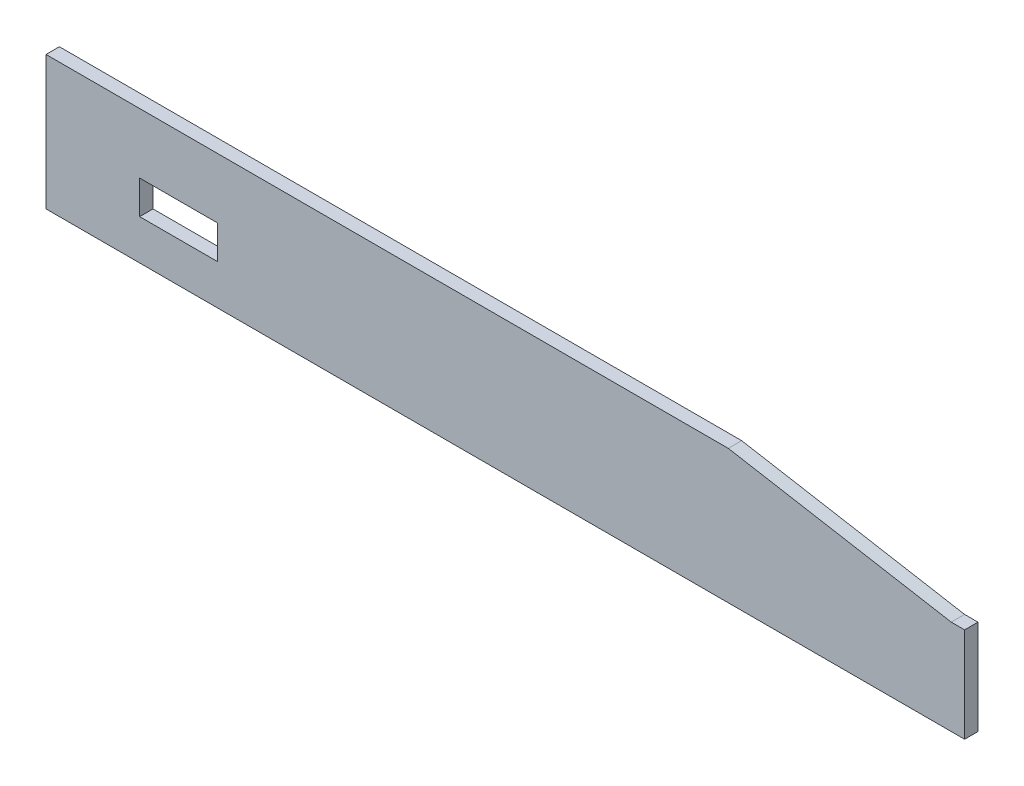
ISO-10303-21;
HEADER;
FILE_DESCRIPTION(('STEP AP214'),'2;1');
FILE_NAME('part.step','',(''),(''),'','','');
FILE_SCHEMA(('AUTOMOTIVE_DESIGN { 1 0 10303 214 1 1 1 1 }'));
ENDSEC;
DATA;
#1=APPLICATION_CONTEXT('core data for automotive mechanical design processes');
#2=APPLICATION_PROTOCOL_DEFINITION('international standard','automotive_design',2000,#1);
#3=PRODUCT_CONTEXT('',#1,'mechanical');
#4=PRODUCT('Part','Part','',(#3));
#5=PRODUCT_RELATED_PRODUCT_CATEGORY('part','',(#4));
#6=PRODUCT_DEFINITION_FORMATION('','',#4);
#7=PRODUCT_DEFINITION_CONTEXT('part definition',#1,'design');
#8=PRODUCT_DEFINITION('design','',#6,#7);
#9=PRODUCT_DEFINITION_SHAPE('','',#8);
#10=(LENGTH_UNIT() NAMED_UNIT(*) SI_UNIT(.MILLI.,.METRE.));
#11=(NAMED_UNIT(*) PLANE_ANGLE_UNIT() SI_UNIT($,.RADIAN.));
#12=(NAMED_UNIT(*) SI_UNIT($,.STERADIAN.) SOLID_ANGLE_UNIT());
#13=UNCERTAINTY_MEASURE_WITH_UNIT(LENGTH_MEASURE(1.E-05),#10,'distance_accuracy_value','');
#14=(GEOMETRIC_REPRESENTATION_CONTEXT(3) GLOBAL_UNCERTAINTY_ASSIGNED_CONTEXT((#13)) GLOBAL_UNIT_ASSIGNED_CONTEXT((#10,
#11,#12)) REPRESENTATION_CONTEXT('',''));
#15=CARTESIAN_POINT('',(0.,0.,0.));
#16=DIRECTION('',(0.,0.,1.));
#17=DIRECTION('',(1.,0.,0.));
#18=AXIS2_PLACEMENT_3D('',#15,#16,#17);
#19=CARTESIAN_POINT('',(0.,0.,6.));
#20=DIRECTION('',(0.,0.,1.));
#21=DIRECTION('',(1.,0.,0.));
#22=AXIS2_PLACEMENT_3D('',#19,#20,#21);
#23=PLANE('',#22);
#24=DIRECTION('',(-1.,0.,0.));
#25=VECTOR('',#24,1.);
#26=CARTESIAN_POINT('',(153.,30.,6.));
#27=LINE('',#26,#25);
#28=CARTESIAN_POINT('',(153.,30.,6.));
#29=VERTEX_POINT('',#28);
#30=CARTESIAN_POINT('',(-153.,30.,6.));
#31=VERTEX_POINT('',#30);
#32=EDGE_CURVE('E145',#29,#31,#27,.T.);
#33=ORIENTED_EDGE('',*,*,#32,.T.);
#34=DIRECTION('',(0.,-1.,0.));
#35=VECTOR('',#34,1.);
#36=CARTESIAN_POINT('',(-153.,30.,6.));
#37=LINE('',#36,#35);
#38=CARTESIAN_POINT('',(-153.,-30.,6.));
#39=VERTEX_POINT('',#38);
#40=EDGE_CURVE('E148',#31,#39,#37,.T.);
#41=ORIENTED_EDGE('',*,*,#40,.T.);
#42=DIRECTION('',(1.,0.,0.));
#43=VECTOR('',#42,1.);
#44=CARTESIAN_POINT('',(-153.,-30.,6.));
#45=LINE('',#44,#43);
#46=CARTESIAN_POINT('',(259.,-30.0000000000001,6.));
#47=VERTEX_POINT('',#46);
#48=EDGE_CURVE('E151',#39,#47,#45,.T.);
#49=ORIENTED_EDGE('',*,*,#48,.T.);
#50=DIRECTION('',(0.,1.,0.));
#51=VECTOR('',#50,1.);
#52=CARTESIAN_POINT('',(259.,-30.0000000000001,6.));
#53=LINE('',#52,#51);
#54=CARTESIAN_POINT('',(259.,12.4999999999999,6.));
#55=VERTEX_POINT('',#54);
#56=EDGE_CURVE('E153',#47,#55,#53,.T.);
#57=ORIENTED_EDGE('',*,*,#56,.T.);
#58=DIRECTION('',(-1.,0.,0.));
#59=VECTOR('',#58,1.);
#60=CARTESIAN_POINT('',(259.,12.4999999999999,6.));
#61=LINE('',#60,#59);
#62=CARTESIAN_POINT('',(253.,12.5000000000001,6.));
#63=VERTEX_POINT('',#62);
#64=EDGE_CURVE('E155',#55,#63,#61,.T.);
#65=ORIENTED_EDGE('',*,*,#64,.T.);
#66=DIRECTION('',(-0.985030467155704,0.172380331752248,0.));
#67=VECTOR('',#66,1.);
#68=CARTESIAN_POINT('',(253.,12.5000000000001,6.));
#69=LINE('',#68,#67);
#70=EDGE_CURVE('E157',#63,#29,#69,.T.);
#71=ORIENTED_EDGE('',*,*,#70,.T.);
#72=EDGE_LOOP('',(#33,#41,#49,#57,#65,#71));
#73=FACE_BOUND('',#72,.T.);
#74=DIRECTION('',(-1.,0.,0.));
#75=VECTOR('',#74,1.);
#76=CARTESIAN_POINT('',(-76.0000000000001,2.99999999999999,6.));
#77=LINE('',#76,#75);
#78=CARTESIAN_POINT('',(-76.0000000000001,2.99999999999999,6.));
#79=VERTEX_POINT('',#78);
#80=CARTESIAN_POINT('',(-111.,2.99999999999998,6.));
#81=VERTEX_POINT('',#80);
#82=EDGE_CURVE('E117',#79,#81,#77,.T.);
#83=ORIENTED_EDGE('',*,*,#82,.F.);
#84=DIRECTION('',(0.,1.,0.));
#85=VECTOR('',#84,1.);
#86=CARTESIAN_POINT('',(-76.0000000000001,2.99999999999999,6.));
#87=LINE('',#86,#85);
#88=CARTESIAN_POINT('',(-76.,-12.,6.));
#89=VERTEX_POINT('',#88);
#90=EDGE_CURVE('E109',#89,#79,#87,.T.);
#91=ORIENTED_EDGE('',*,*,#90,.F.);
#92=DIRECTION('',(1.,0.,0.));
#93=VECTOR('',#92,1.);
#94=CARTESIAN_POINT('',(-76.,-12.,6.));
#95=LINE('',#94,#93);
#96=CARTESIAN_POINT('',(-111.,-12.,6.));
#97=VERTEX_POINT('',#96);
#98=EDGE_CURVE('E131',#97,#89,#95,.T.);
#99=ORIENTED_EDGE('',*,*,#98,.F.);
#100=DIRECTION('',(0.,-1.,0.));
#101=VECTOR('',#100,1.);
#102=CARTESIAN_POINT('',(-111.,2.99999999999998,6.));
#103=LINE('',#102,#101);
#104=EDGE_CURVE('E129',#81,#97,#103,.T.);
#105=ORIENTED_EDGE('',*,*,#104,.F.);
#106=EDGE_LOOP('',(#83,#91,#99,#105));
#107=FACE_BOUND('',#106,.T.);
#108=ADVANCED_FACE('F32',(#73,#107),#23,.T.);
#109=CARTESIAN_POINT('',(0.,0.,0.));
#110=DIRECTION('',(0.,0.,1.));
#111=DIRECTION('',(1.,0.,0.));
#112=AXIS2_PLACEMENT_3D('',#109,#110,#111);
#113=PLANE('',#112);
#114=DIRECTION('',(-1.,0.,0.));
#115=VECTOR('',#114,1.);
#116=CARTESIAN_POINT('',(153.,30.,0.));
#117=LINE('',#116,#115);
#118=CARTESIAN_POINT('',(153.,30.,0.));
#119=VERTEX_POINT('',#118);
#120=CARTESIAN_POINT('',(-153.,30.,0.));
#121=VERTEX_POINT('',#120);
#122=EDGE_CURVE('E125',#119,#121,#117,.T.);
#123=ORIENTED_EDGE('',*,*,#122,.F.);
#124=DIRECTION('',(-0.985030467155704,0.172380331752248,0.));
#125=VECTOR('',#124,1.);
#126=CARTESIAN_POINT('',(253.,12.5000000000001,0.));
#127=LINE('',#126,#125);
#128=CARTESIAN_POINT('',(253.,12.5000000000001,0.));
#129=VERTEX_POINT('',#128);
#130=EDGE_CURVE('E149',#129,#119,#127,.T.);
#131=ORIENTED_EDGE('',*,*,#130,.F.);
#132=DIRECTION('',(-1.,0.,0.));
#133=VECTOR('',#132,1.);
#134=CARTESIAN_POINT('',(259.,12.4999999999999,0.));
#135=LINE('',#134,#133);
#136=CARTESIAN_POINT('',(259.,12.4999999999999,0.));
#137=VERTEX_POINT('',#136);
#138=EDGE_CURVE('E168',#137,#129,#135,.T.);
#139=ORIENTED_EDGE('',*,*,#138,.F.);
#140=DIRECTION('',(0.,1.,0.));
#141=VECTOR('',#140,1.);
#142=CARTESIAN_POINT('',(259.,-30.0000000000001,0.));
#143=LINE('',#142,#141);
#144=CARTESIAN_POINT('',(259.,-30.0000000000001,0.));
#145=VERTEX_POINT('',#144);
#146=EDGE_CURVE('E166',#145,#137,#143,.T.);
#147=ORIENTED_EDGE('',*,*,#146,.F.);
#148=DIRECTION('',(1.,0.,0.));
#149=VECTOR('',#148,1.);
#150=CARTESIAN_POINT('',(-153.,-30.,0.));
#151=LINE('',#150,#149);
#152=CARTESIAN_POINT('',(-153.,-30.,0.));
#153=VERTEX_POINT('',#152);
#154=EDGE_CURVE('E164',#153,#145,#151,.T.);
#155=ORIENTED_EDGE('',*,*,#154,.F.);
#156=DIRECTION('',(0.,-1.,0.));
#157=VECTOR('',#156,1.);
#158=CARTESIAN_POINT('',(-153.,30.,0.));
#159=LINE('',#158,#157);
#160=EDGE_CURVE('E162',#121,#153,#159,.T.);
#161=ORIENTED_EDGE('',*,*,#160,.F.);
#162=EDGE_LOOP('',(#123,#131,#139,#147,#155,#161));
#163=FACE_BOUND('',#162,.T.);
#164=DIRECTION('',(0.,1.,0.));
#165=VECTOR('',#164,1.);
#166=CARTESIAN_POINT('',(-76.0000000000001,2.99999999999999,0.));
#167=LINE('',#166,#165);
#168=CARTESIAN_POINT('',(-76.,-12.,0.));
#169=VERTEX_POINT('',#168);
#170=CARTESIAN_POINT('',(-76.0000000000001,2.99999999999999,0.));
#171=VERTEX_POINT('',#170);
#172=EDGE_CURVE('E55',#169,#171,#167,.T.);
#173=ORIENTED_EDGE('',*,*,#172,.T.);
#174=DIRECTION('',(-1.,0.,0.));
#175=VECTOR('',#174,1.);
#176=CARTESIAN_POINT('',(-76.0000000000001,2.99999999999999,0.));
#177=LINE('',#176,#175);
#178=CARTESIAN_POINT('',(-111.,2.99999999999998,0.));
#179=VERTEX_POINT('',#178);
#180=EDGE_CURVE('E124',#171,#179,#177,.T.);
#181=ORIENTED_EDGE('',*,*,#180,.T.);
#182=DIRECTION('',(0.,-1.,0.));
#183=VECTOR('',#182,1.);
#184=CARTESIAN_POINT('',(-111.,2.99999999999998,0.));
#185=LINE('',#184,#183);
#186=CARTESIAN_POINT('',(-111.,-12.,0.));
#187=VERTEX_POINT('',#186);
#188=EDGE_CURVE('E137',#179,#187,#185,.T.);
#189=ORIENTED_EDGE('',*,*,#188,.T.);
#190=DIRECTION('',(1.,0.,0.));
#191=VECTOR('',#190,1.);
#192=CARTESIAN_POINT('',(-76.,-12.,0.));
#193=LINE('',#192,#191);
#194=EDGE_CURVE('E118',#187,#169,#193,.T.);
#195=ORIENTED_EDGE('',*,*,#194,.T.);
#196=EDGE_LOOP('',(#173,#181,#189,#195));
#197=FACE_BOUND('',#196,.T.);
#198=ADVANCED_FACE('F192',(#163,#197),#113,.F.);
#199=CARTESIAN_POINT('',(153.,30.,6.));
#200=DIRECTION('',(0.,-1.,0.));
#201=DIRECTION('',(0.,0.,-1.));
#202=AXIS2_PLACEMENT_3D('',#199,#200,#201);
#203=PLANE('',#202);
#204=ORIENTED_EDGE('',*,*,#122,.T.);
#205=DIRECTION('',(0.,0.,-1.));
#206=VECTOR('',#205,1.);
#207=CARTESIAN_POINT('',(-153.,30.,6.));
#208=LINE('',#207,#206);
#209=EDGE_CURVE('E11',#31,#121,#208,.T.);
#210=ORIENTED_EDGE('',*,*,#209,.F.);
#211=ORIENTED_EDGE('',*,*,#32,.F.);
#212=DIRECTION('',(0.,0.,-1.));
#213=VECTOR('',#212,1.);
#214=CARTESIAN_POINT('',(153.,30.,6.));
#215=LINE('',#214,#213);
#216=EDGE_CURVE('E159',#29,#119,#215,.T.);
#217=ORIENTED_EDGE('',*,*,#216,.T.);
#218=EDGE_LOOP('',(#204,#210,#211,#217));
#219=FACE_BOUND('',#218,.T.);
#220=ADVANCED_FACE('F34',(#219),#203,.F.);
#221=CARTESIAN_POINT('',(-153.,30.,6.));
#222=DIRECTION('',(1.,0.,0.));
#223=DIRECTION('',(0.,0.,-1.));
#224=AXIS2_PLACEMENT_3D('',#221,#222,#223);
#225=PLANE('',#224);
#226=ORIENTED_EDGE('',*,*,#160,.T.);
#227=DIRECTION('',(0.,0.,-1.));
#228=VECTOR('',#227,1.);
#229=CARTESIAN_POINT('',(-153.,-30.,6.));
#230=LINE('',#229,#228);
#231=EDGE_CURVE('E40',#39,#153,#230,.T.);
#232=ORIENTED_EDGE('',*,*,#231,.F.);
#233=ORIENTED_EDGE('',*,*,#40,.F.);
#234=ORIENTED_EDGE('',*,*,#209,.T.);
#235=EDGE_LOOP('',(#226,#232,#233,#234));
#236=FACE_BOUND('',#235,.T.);
#237=ADVANCED_FACE('F209',(#236),#225,.F.);
#238=CARTESIAN_POINT('',(-153.,-30.,6.));
#239=DIRECTION('',(0.,1.,0.));
#240=DIRECTION('',(-1.,0.,0.));
#241=AXIS2_PLACEMENT_3D('',#238,#239,#240);
#242=PLANE('',#241);
#243=ORIENTED_EDGE('',*,*,#154,.T.);
#244=DIRECTION('',(0.,0.,-1.));
#245=VECTOR('',#244,1.);
#246=CARTESIAN_POINT('',(259.,-30.0000000000001,6.));
#247=LINE('',#246,#245);
#248=EDGE_CURVE('E179',#47,#145,#247,.T.);
#249=ORIENTED_EDGE('',*,*,#248,.F.);
#250=ORIENTED_EDGE('',*,*,#48,.F.);
#251=ORIENTED_EDGE('',*,*,#231,.T.);
#252=EDGE_LOOP('',(#243,#249,#250,#251));
#253=FACE_BOUND('',#252,.T.);
#254=ADVANCED_FACE('F186',(#253),#242,.F.);
#255=CARTESIAN_POINT('',(259.,-30.0000000000001,6.));
#256=DIRECTION('',(-1.,0.,0.));
#257=DIRECTION('',(0.,0.,1.));
#258=AXIS2_PLACEMENT_3D('',#255,#256,#257);
#259=PLANE('',#258);
#260=ORIENTED_EDGE('',*,*,#146,.T.);
#261=DIRECTION('',(0.,0.,-1.));
#262=VECTOR('',#261,1.);
#263=CARTESIAN_POINT('',(259.,12.4999999999999,6.));
#264=LINE('',#263,#262);
#265=EDGE_CURVE('E176',#55,#137,#264,.T.);
#266=ORIENTED_EDGE('',*,*,#265,.F.);
#267=ORIENTED_EDGE('',*,*,#56,.F.);
#268=ORIENTED_EDGE('',*,*,#248,.T.);
#269=EDGE_LOOP('',(#260,#266,#267,#268));
#270=FACE_BOUND('',#269,.T.);
#271=ADVANCED_FACE('F198',(#270),#259,.F.);
#272=CARTESIAN_POINT('',(259.,12.4999999999999,6.));
#273=DIRECTION('',(0.,-1.,0.));
#274=DIRECTION('',(1.,0.,0.));
#275=AXIS2_PLACEMENT_3D('',#272,#273,#274);
#276=PLANE('',#275);
#277=ORIENTED_EDGE('',*,*,#138,.T.);
#278=DIRECTION('',(0.,0.,-1.));
#279=VECTOR('',#278,1.);
#280=CARTESIAN_POINT('',(253.,12.5000000000001,6.));
#281=LINE('',#280,#279);
#282=EDGE_CURVE('E173',#63,#129,#281,.T.);
#283=ORIENTED_EDGE('',*,*,#282,.F.);
#284=ORIENTED_EDGE('',*,*,#64,.F.);
#285=ORIENTED_EDGE('',*,*,#265,.T.);
#286=EDGE_LOOP('',(#277,#283,#284,#285));
#287=FACE_BOUND('',#286,.T.);
#288=ADVANCED_FACE('F202',(#287),#276,.F.);
#289=CARTESIAN_POINT('',(253.,12.5000000000001,6.));
#290=DIRECTION('',(-0.172380331752248,-0.985030467155704,0.));
#291=DIRECTION('',(0.985030467155704,-0.172380331752248,0.));
#292=AXIS2_PLACEMENT_3D('',#289,#290,#291);
#293=PLANE('',#292);
#294=ORIENTED_EDGE('',*,*,#130,.T.);
#295=ORIENTED_EDGE('',*,*,#216,.F.);
#296=ORIENTED_EDGE('',*,*,#70,.F.);
#297=ORIENTED_EDGE('',*,*,#282,.T.);
#298=EDGE_LOOP('',(#294,#295,#296,#297));
#299=FACE_BOUND('',#298,.T.);
#300=ADVANCED_FACE('F212',(#299),#293,.F.);
#301=CARTESIAN_POINT('',(-76.0000000000001,2.99999999999999,6.));
#302=DIRECTION('',(-1.,0.,0.));
#303=DIRECTION('',(0.,-1.,0.));
#304=AXIS2_PLACEMENT_3D('',#301,#302,#303);
#305=PLANE('',#304);
#306=ORIENTED_EDGE('',*,*,#172,.F.);
#307=DIRECTION('',(0.,0.,-1.));
#308=VECTOR('',#307,1.);
#309=CARTESIAN_POINT('',(-76.,-12.,6.));
#310=LINE('',#309,#308);
#311=EDGE_CURVE('E113',#89,#169,#310,.T.);
#312=ORIENTED_EDGE('',*,*,#311,.F.);
#313=ORIENTED_EDGE('',*,*,#90,.T.);
#314=DIRECTION('',(0.,0.,-1.));
#315=VECTOR('',#314,1.);
#316=CARTESIAN_POINT('',(-76.0000000000001,2.99999999999999,6.));
#317=LINE('',#316,#315);
#318=EDGE_CURVE('E112',#79,#171,#317,.T.);
#319=ORIENTED_EDGE('',*,*,#318,.T.);
#320=EDGE_LOOP('',(#306,#312,#313,#319));
#321=FACE_BOUND('',#320,.T.);
#322=ADVANCED_FACE('F111',(#321),#305,.T.);
#323=CARTESIAN_POINT('',(-76.0000000000001,2.99999999999999,6.));
#324=DIRECTION('',(0.,-1.,0.));
#325=DIRECTION('',(1.,0.,0.));
#326=AXIS2_PLACEMENT_3D('',#323,#324,#325);
#327=PLANE('',#326);
#328=ORIENTED_EDGE('',*,*,#180,.F.);
#329=ORIENTED_EDGE('',*,*,#318,.F.);
#330=ORIENTED_EDGE('',*,*,#82,.T.);
#331=DIRECTION('',(0.,0.,-1.));
#332=VECTOR('',#331,1.);
#333=CARTESIAN_POINT('',(-111.,2.99999999999998,6.));
#334=LINE('',#333,#332);
#335=EDGE_CURVE('E126',#81,#179,#334,.T.);
#336=ORIENTED_EDGE('',*,*,#335,.T.);
#337=EDGE_LOOP('',(#328,#329,#330,#336));
#338=FACE_BOUND('',#337,.T.);
#339=ADVANCED_FACE('F121',(#338),#327,.T.);
#340=CARTESIAN_POINT('',(-111.,2.99999999999998,6.));
#341=DIRECTION('',(1.,0.,0.));
#342=DIRECTION('',(0.,1.,0.));
#343=AXIS2_PLACEMENT_3D('',#340,#341,#342);
#344=PLANE('',#343);
#345=ORIENTED_EDGE('',*,*,#188,.F.);
#346=ORIENTED_EDGE('',*,*,#335,.F.);
#347=ORIENTED_EDGE('',*,*,#104,.T.);
#348=DIRECTION('',(0.,0.,-1.));
#349=VECTOR('',#348,1.);
#350=CARTESIAN_POINT('',(-111.,-12.,6.));
#351=LINE('',#350,#349);
#352=EDGE_CURVE('E47',#97,#187,#351,.T.);
#353=ORIENTED_EDGE('',*,*,#352,.T.);
#354=EDGE_LOOP('',(#345,#346,#347,#353));
#355=FACE_BOUND('',#354,.T.);
#356=ADVANCED_FACE('F230',(#355),#344,.T.);
#357=CARTESIAN_POINT('',(-76.,-12.,6.));
#358=DIRECTION('',(0.,1.,0.));
#359=DIRECTION('',(-1.,0.,0.));
#360=AXIS2_PLACEMENT_3D('',#357,#358,#359);
#361=PLANE('',#360);
#362=ORIENTED_EDGE('',*,*,#194,.F.);
#363=ORIENTED_EDGE('',*,*,#352,.F.);
#364=ORIENTED_EDGE('',*,*,#98,.T.);
#365=ORIENTED_EDGE('',*,*,#311,.T.);
#366=EDGE_LOOP('',(#362,#363,#364,#365));
#367=FACE_BOUND('',#366,.T.);
#368=ADVANCED_FACE('F233',(#367),#361,.T.);
#369=CLOSED_SHELL('',(#108,#198,#220,#237,#254,#271,#288,#300,#322,#339,#356,#368));
#370=MANIFOLD_SOLID_BREP('B2',#369);
#371=ADVANCED_BREP_SHAPE_REPRESENTATION('',(#18,#370),#14);
#372=SHAPE_DEFINITION_REPRESENTATION(#9,#371);
ENDSEC;
END-ISO-10303-21;
